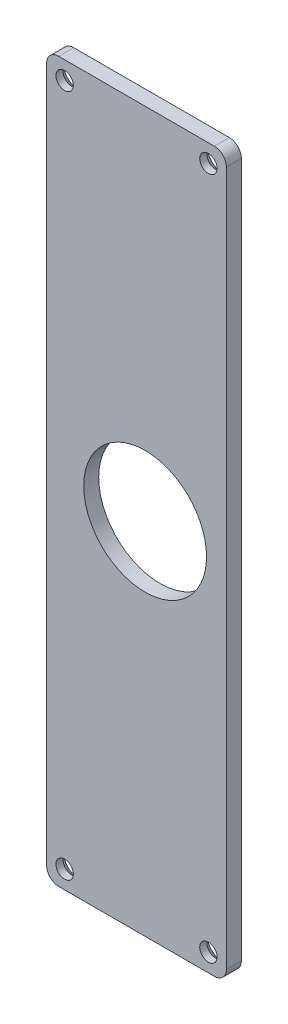
ISO-10303-21;
HEADER;
FILE_DESCRIPTION(('STEP AP214'),'2;1');
FILE_NAME('part.step','',(''),(''),'','','');
FILE_SCHEMA(('AUTOMOTIVE_DESIGN { 1 0 10303 214 1 1 1 1 }'));
ENDSEC;
DATA;
#1=APPLICATION_CONTEXT('core data for automotive mechanical design processes');
#2=APPLICATION_PROTOCOL_DEFINITION('international standard','automotive_design',2000,#1);
#3=PRODUCT_CONTEXT('',#1,'mechanical');
#4=PRODUCT('Part','Part','',(#3));
#5=PRODUCT_RELATED_PRODUCT_CATEGORY('part','',(#4));
#6=PRODUCT_DEFINITION_FORMATION('','',#4);
#7=PRODUCT_DEFINITION_CONTEXT('part definition',#1,'design');
#8=PRODUCT_DEFINITION('design','',#6,#7);
#9=PRODUCT_DEFINITION_SHAPE('','',#8);
#10=(LENGTH_UNIT() NAMED_UNIT(*) SI_UNIT(.MILLI.,.METRE.));
#11=(NAMED_UNIT(*) PLANE_ANGLE_UNIT() SI_UNIT($,.RADIAN.));
#12=(NAMED_UNIT(*) SI_UNIT($,.STERADIAN.) SOLID_ANGLE_UNIT());
#13=UNCERTAINTY_MEASURE_WITH_UNIT(LENGTH_MEASURE(1.E-05),#10,'distance_accuracy_value','');
#14=(GEOMETRIC_REPRESENTATION_CONTEXT(3) GLOBAL_UNCERTAINTY_ASSIGNED_CONTEXT((#13)) GLOBAL_UNIT_ASSIGNED_CONTEXT((#10,
#11,#12)) REPRESENTATION_CONTEXT('',''));
#15=CARTESIAN_POINT('',(0.,0.,0.));
#16=DIRECTION('',(0.,0.,1.));
#17=DIRECTION('',(1.,0.,0.));
#18=AXIS2_PLACEMENT_3D('',#15,#16,#17);
#19=CARTESIAN_POINT('',(-91.1225727439967,-25.5678939773836,2.5));
#20=DIRECTION('',(0.,0.,-1.));
#21=DIRECTION('',(-1.,0.,0.));
#22=AXIS2_PLACEMENT_3D('',#19,#20,#21);
#23=CYLINDRICAL_SURFACE('',#22,1.99999999999999);
#24=CARTESIAN_POINT('',(-91.1225727439967,-25.5678939773836,0.));
#25=DIRECTION('',(0.,0.,1.));
#26=DIRECTION('',(-1.,0.,0.));
#27=AXIS2_PLACEMENT_3D('',#24,#25,#26);
#28=CIRCLE('',#27,1.99999999999999);
#29=CARTESIAN_POINT('',(-93.1225727439967,-25.5678939773836,0.));
#30=VERTEX_POINT('',#29);
#31=CARTESIAN_POINT('',(-91.1225727439967,-27.5678939773836,0.));
#32=VERTEX_POINT('',#31);
#33=EDGE_CURVE('E135',#30,#32,#28,.T.);
#34=ORIENTED_EDGE('',*,*,#33,.T.);
#35=DIRECTION('',(0.,0.,-1.));
#36=VECTOR('',#35,1.);
#37=CARTESIAN_POINT('',(-91.1225727439967,-27.5678939773836,2.5));
#38=LINE('',#37,#36);
#39=CARTESIAN_POINT('',(-91.1225727439967,-27.5678939773836,2.5));
#40=VERTEX_POINT('',#39);
#41=EDGE_CURVE('E11',#40,#32,#38,.T.);
#42=ORIENTED_EDGE('',*,*,#41,.F.);
#43=CARTESIAN_POINT('',(-91.1225727439967,-25.5678939773836,2.5));
#44=DIRECTION('',(0.,0.,1.));
#45=DIRECTION('',(-1.,0.,0.));
#46=AXIS2_PLACEMENT_3D('',#43,#44,#45);
#47=CIRCLE('',#46,1.99999999999999);
#48=CARTESIAN_POINT('',(-93.1225727439967,-25.5678939773836,2.5));
#49=VERTEX_POINT('',#48);
#50=EDGE_CURVE('E150',#49,#40,#47,.T.);
#51=ORIENTED_EDGE('',*,*,#50,.F.);
#52=DIRECTION('',(0.,0.,-1.));
#53=VECTOR('',#52,1.);
#54=CARTESIAN_POINT('',(-93.1225727439967,-25.5678939773836,2.5));
#55=LINE('',#54,#53);
#56=EDGE_CURVE('E131',#49,#30,#55,.T.);
#57=ORIENTED_EDGE('',*,*,#56,.T.);
#58=EDGE_LOOP('',(#34,#42,#51,#57));
#59=FACE_BOUND('',#58,.T.);
#60=ADVANCED_FACE('F39',(#59),#23,.T.);
#61=CARTESIAN_POINT('',(-91.1225727439967,-27.5678939773836,2.5));
#62=DIRECTION('',(0.,1.,0.));
#63=DIRECTION('',(-1.,0.,0.));
#64=AXIS2_PLACEMENT_3D('',#61,#62,#63);
#65=PLANE('',#64);
#66=DIRECTION('',(1.,0.,0.));
#67=VECTOR('',#66,1.);
#68=CARTESIAN_POINT('',(-91.1225727439967,-27.5678939773836,0.));
#69=LINE('',#68,#67);
#70=CARTESIAN_POINT('',(-65.1225727439967,-27.5678939773836,0.));
#71=VERTEX_POINT('',#70);
#72=EDGE_CURVE('E138',#32,#71,#69,.T.);
#73=ORIENTED_EDGE('',*,*,#72,.T.);
#74=DIRECTION('',(0.,0.,-1.));
#75=VECTOR('',#74,1.);
#76=CARTESIAN_POINT('',(-65.1225727439967,-27.5678939773836,2.5));
#77=LINE('',#76,#75);
#78=CARTESIAN_POINT('',(-65.1225727439967,-27.5678939773836,2.5));
#79=VERTEX_POINT('',#78);
#80=EDGE_CURVE('E47',#79,#71,#77,.T.);
#81=ORIENTED_EDGE('',*,*,#80,.F.);
#82=DIRECTION('',(1.,0.,0.));
#83=VECTOR('',#82,1.);
#84=CARTESIAN_POINT('',(-91.1225727439967,-27.5678939773836,2.5));
#85=LINE('',#84,#83);
#86=EDGE_CURVE('E98',#40,#79,#85,.T.);
#87=ORIENTED_EDGE('',*,*,#86,.F.);
#88=ORIENTED_EDGE('',*,*,#41,.T.);
#89=EDGE_LOOP('',(#73,#81,#87,#88));
#90=FACE_BOUND('',#89,.T.);
#91=ADVANCED_FACE('F262',(#90),#65,.F.);
#92=CARTESIAN_POINT('',(-65.1225727439967,-25.5678939773836,2.5));
#93=DIRECTION('',(0.,0.,-1.));
#94=DIRECTION('',(-1.,0.,0.));
#95=AXIS2_PLACEMENT_3D('',#92,#93,#94);
#96=CYLINDRICAL_SURFACE('',#95,2.);
#97=CARTESIAN_POINT('',(-65.1225727439967,-25.5678939773836,0.));
#98=DIRECTION('',(0.,0.,1.));
#99=DIRECTION('',(1.,0.,0.));
#100=AXIS2_PLACEMENT_3D('',#97,#98,#99);
#101=CIRCLE('',#100,2.);
#102=CARTESIAN_POINT('',(-63.1225727439967,-25.5678939773836,0.));
#103=VERTEX_POINT('',#102);
#104=EDGE_CURVE('E141',#71,#103,#101,.T.);
#105=ORIENTED_EDGE('',*,*,#104,.T.);
#106=DIRECTION('',(0.,0.,-1.));
#107=VECTOR('',#106,1.);
#108=CARTESIAN_POINT('',(-63.1225727439967,-25.5678939773836,2.5));
#109=LINE('',#108,#107);
#110=CARTESIAN_POINT('',(-63.1225727439967,-25.5678939773836,2.5));
#111=VERTEX_POINT('',#110);
#112=EDGE_CURVE('E157',#111,#103,#109,.T.);
#113=ORIENTED_EDGE('',*,*,#112,.F.);
#114=CARTESIAN_POINT('',(-65.1225727439967,-25.5678939773836,2.5));
#115=DIRECTION('',(0.,0.,1.));
#116=DIRECTION('',(1.,0.,0.));
#117=AXIS2_PLACEMENT_3D('',#114,#115,#116);
#118=CIRCLE('',#117,2.);
#119=EDGE_CURVE('E165',#79,#111,#118,.T.);
#120=ORIENTED_EDGE('',*,*,#119,.F.);
#121=ORIENTED_EDGE('',*,*,#80,.T.);
#122=EDGE_LOOP('',(#105,#113,#120,#121));
#123=FACE_BOUND('',#122,.T.);
#124=ADVANCED_FACE('F163',(#123),#96,.T.);
#125=CARTESIAN_POINT('',(-63.1225727439967,90.4321060226164,2.5));
#126=DIRECTION('',(-1.,0.,0.));
#127=DIRECTION('',(0.,-1.,0.));
#128=AXIS2_PLACEMENT_3D('',#125,#126,#127);
#129=PLANE('',#128);
#130=DIRECTION('',(0.,1.,0.));
#131=VECTOR('',#130,1.);
#132=CARTESIAN_POINT('',(-63.1225727439967,90.4321060226164,0.));
#133=LINE('',#132,#131);
#134=CARTESIAN_POINT('',(-63.1225727439967,90.4321060226164,0.));
#135=VERTEX_POINT('',#134);
#136=EDGE_CURVE('E143',#103,#135,#133,.T.);
#137=ORIENTED_EDGE('',*,*,#136,.T.);
#138=DIRECTION('',(0.,0.,-1.));
#139=VECTOR('',#138,1.);
#140=CARTESIAN_POINT('',(-63.1225727439967,90.4321060226164,2.5));
#141=LINE('',#140,#139);
#142=CARTESIAN_POINT('',(-63.1225727439967,90.4321060226164,2.5));
#143=VERTEX_POINT('',#142);
#144=EDGE_CURVE('E154',#143,#135,#141,.T.);
#145=ORIENTED_EDGE('',*,*,#144,.F.);
#146=DIRECTION('',(0.,1.,0.));
#147=VECTOR('',#146,1.);
#148=CARTESIAN_POINT('',(-63.1225727439967,90.4321060226164,2.5));
#149=LINE('',#148,#147);
#150=EDGE_CURVE('E177',#111,#143,#149,.T.);
#151=ORIENTED_EDGE('',*,*,#150,.F.);
#152=ORIENTED_EDGE('',*,*,#112,.T.);
#153=EDGE_LOOP('',(#137,#145,#151,#152));
#154=FACE_BOUND('',#153,.T.);
#155=ADVANCED_FACE('F173',(#154),#129,.F.);
#156=CARTESIAN_POINT('',(-65.1225727439967,90.4321060226164,2.5));
#157=DIRECTION('',(0.,0.,-1.));
#158=DIRECTION('',(-1.,0.,0.));
#159=AXIS2_PLACEMENT_3D('',#156,#157,#158);
#160=CYLINDRICAL_SURFACE('',#159,2.);
#161=CARTESIAN_POINT('',(-65.1225727439967,90.4321060226164,0.));
#162=DIRECTION('',(0.,0.,1.));
#163=DIRECTION('',(-1.,0.,0.));
#164=AXIS2_PLACEMENT_3D('',#161,#162,#163);
#165=CIRCLE('',#164,2.);
#166=CARTESIAN_POINT('',(-65.1225727439967,92.4321060226164,0.));
#167=VERTEX_POINT('',#166);
#168=EDGE_CURVE('E145',#135,#167,#165,.T.);
#169=ORIENTED_EDGE('',*,*,#168,.T.);
#170=DIRECTION('',(0.,0.,-1.));
#171=VECTOR('',#170,1.);
#172=CARTESIAN_POINT('',(-65.1225727439967,92.4321060226164,2.5));
#173=LINE('',#172,#171);
#174=CARTESIAN_POINT('',(-65.1225727439967,92.4321060226164,2.5));
#175=VERTEX_POINT('',#174);
#176=EDGE_CURVE('E126',#175,#167,#173,.T.);
#177=ORIENTED_EDGE('',*,*,#176,.F.);
#178=CARTESIAN_POINT('',(-65.1225727439967,90.4321060226164,2.5));
#179=DIRECTION('',(0.,0.,1.));
#180=DIRECTION('',(-1.,0.,0.));
#181=AXIS2_PLACEMENT_3D('',#178,#179,#180);
#182=CIRCLE('',#181,2.);
#183=EDGE_CURVE('E117',#143,#175,#182,.T.);
#184=ORIENTED_EDGE('',*,*,#183,.F.);
#185=ORIENTED_EDGE('',*,*,#144,.T.);
#186=EDGE_LOOP('',(#169,#177,#184,#185));
#187=FACE_BOUND('',#186,.T.);
#188=ADVANCED_FACE('F176',(#187),#160,.T.);
#189=CARTESIAN_POINT('',(-91.1225727439967,92.4321060226164,2.5));
#190=DIRECTION('',(0.,-1.,0.));
#191=DIRECTION('',(0.,0.,-1.));
#192=AXIS2_PLACEMENT_3D('',#189,#190,#191);
#193=PLANE('',#192);
#194=DIRECTION('',(-1.,0.,0.));
#195=VECTOR('',#194,1.);
#196=CARTESIAN_POINT('',(-91.1225727439967,92.4321060226164,0.));
#197=LINE('',#196,#195);
#198=CARTESIAN_POINT('',(-91.1225727439967,92.4321060226164,0.));
#199=VERTEX_POINT('',#198);
#200=EDGE_CURVE('E125',#167,#199,#197,.T.);
#201=ORIENTED_EDGE('',*,*,#200,.T.);
#202=DIRECTION('',(0.,0.,-1.));
#203=VECTOR('',#202,1.);
#204=CARTESIAN_POINT('',(-91.1225727439967,92.4321060226164,2.5));
#205=LINE('',#204,#203);
#206=CARTESIAN_POINT('',(-91.1225727439967,92.4321060226164,2.5));
#207=VERTEX_POINT('',#206);
#208=EDGE_CURVE('E122',#207,#199,#205,.T.);
#209=ORIENTED_EDGE('',*,*,#208,.F.);
#210=DIRECTION('',(-1.,0.,0.));
#211=VECTOR('',#210,1.);
#212=CARTESIAN_POINT('',(-91.1225727439967,92.4321060226164,2.5));
#213=LINE('',#212,#211);
#214=EDGE_CURVE('E111',#175,#207,#213,.T.);
#215=ORIENTED_EDGE('',*,*,#214,.F.);
#216=ORIENTED_EDGE('',*,*,#176,.T.);
#217=EDGE_LOOP('',(#201,#209,#215,#216));
#218=FACE_BOUND('',#217,.T.);
#219=ADVANCED_FACE('F123',(#218),#193,.F.);
#220=CARTESIAN_POINT('',(-91.1225727439967,90.4321060226164,2.5));
#221=DIRECTION('',(0.,0.,-1.));
#222=DIRECTION('',(-1.,0.,0.));
#223=AXIS2_PLACEMENT_3D('',#220,#221,#222);
#224=CYLINDRICAL_SURFACE('',#223,1.99999999999999);
#225=CARTESIAN_POINT('',(-91.1225727439967,90.4321060226164,0.));
#226=DIRECTION('',(0.,0.,1.));
#227=DIRECTION('',(-1.,0.,0.));
#228=AXIS2_PLACEMENT_3D('',#225,#226,#227);
#229=CIRCLE('',#228,1.99999999999999);
#230=CARTESIAN_POINT('',(-93.1225727439967,90.4321060226164,0.));
#231=VERTEX_POINT('',#230);
#232=EDGE_CURVE('E84',#199,#231,#229,.T.);
#233=ORIENTED_EDGE('',*,*,#232,.T.);
#234=DIRECTION('',(0.,0.,-1.));
#235=VECTOR('',#234,1.);
#236=CARTESIAN_POINT('',(-93.1225727439967,90.4321060226164,2.5));
#237=LINE('',#236,#235);
#238=CARTESIAN_POINT('',(-93.1225727439967,90.4321060226164,2.5));
#239=VERTEX_POINT('',#238);
#240=EDGE_CURVE('E127',#239,#231,#237,.T.);
#241=ORIENTED_EDGE('',*,*,#240,.F.);
#242=CARTESIAN_POINT('',(-91.1225727439967,90.4321060226164,2.5));
#243=DIRECTION('',(0.,0.,1.));
#244=DIRECTION('',(-1.,0.,0.));
#245=AXIS2_PLACEMENT_3D('',#242,#243,#244);
#246=CIRCLE('',#245,1.99999999999999);
#247=EDGE_CURVE('E115',#207,#239,#246,.T.);
#248=ORIENTED_EDGE('',*,*,#247,.F.);
#249=ORIENTED_EDGE('',*,*,#208,.T.);
#250=EDGE_LOOP('',(#233,#241,#248,#249));
#251=FACE_BOUND('',#250,.T.);
#252=ADVANCED_FACE('F129',(#251),#224,.T.);
#253=CARTESIAN_POINT('',(-93.1225727439967,-25.5678939773836,2.5));
#254=DIRECTION('',(1.,0.,0.));
#255=DIRECTION('',(0.,0.,-1.));
#256=AXIS2_PLACEMENT_3D('',#253,#254,#255);
#257=PLANE('',#256);
#258=DIRECTION('',(0.,-1.,0.));
#259=VECTOR('',#258,1.);
#260=CARTESIAN_POINT('',(-93.1225727439967,-25.5678939773836,0.));
#261=LINE('',#260,#259);
#262=EDGE_CURVE('E90',#231,#30,#261,.T.);
#263=ORIENTED_EDGE('',*,*,#262,.T.);
#264=ORIENTED_EDGE('',*,*,#56,.F.);
#265=DIRECTION('',(0.,-1.,0.));
#266=VECTOR('',#265,1.);
#267=CARTESIAN_POINT('',(-93.1225727439967,-25.5678939773836,2.5));
#268=LINE('',#267,#266);
#269=EDGE_CURVE('E55',#239,#49,#268,.T.);
#270=ORIENTED_EDGE('',*,*,#269,.F.);
#271=ORIENTED_EDGE('',*,*,#240,.T.);
#272=EDGE_LOOP('',(#263,#264,#270,#271));
#273=FACE_BOUND('',#272,.T.);
#274=ADVANCED_FACE('F269',(#273),#257,.F.);
#275=CARTESIAN_POINT('',(-91.1225727439967,-25.5678939773836,2.5));
#276=DIRECTION('',(0.,0.,-1.));
#277=DIRECTION('',(-1.,0.,0.));
#278=AXIS2_PLACEMENT_3D('',#275,#276,#277);
#279=PLANE('',#278);
#280=CARTESIAN_POINT('',(-76.6825727439967,32.4321060226164,2.5));
#281=DIRECTION('',(0.,0.,-1.));
#282=DIRECTION('',(-1.,0.,0.));
#283=AXIS2_PLACEMENT_3D('',#280,#281,#282);
#284=CIRCLE('',#283,10.25);
#285=CARTESIAN_POINT('',(-86.9325727439967,32.4321060226164,2.5));
#286=VERTEX_POINT('',#285);
#287=EDGE_CURVE('E218',#286,#286,#284,.T.);
#288=ORIENTED_EDGE('',*,*,#287,.T.);
#289=EDGE_LOOP('',(#288));
#290=FACE_BOUND('',#289,.T.);
#291=CARTESIAN_POINT('',(-66.1225727439967,89.4321060226164,2.5));
#292=DIRECTION('',(0.,0.,-1.));
#293=DIRECTION('',(-1.,0.,0.));
#294=AXIS2_PLACEMENT_3D('',#291,#292,#293);
#295=CIRCLE('',#294,1.44999999999999);
#296=CARTESIAN_POINT('',(-67.5725727439967,89.4321060226164,2.5));
#297=VERTEX_POINT('',#296);
#298=EDGE_CURVE('E209',#297,#297,#295,.T.);
#299=ORIENTED_EDGE('',*,*,#298,.T.);
#300=EDGE_LOOP('',(#299));
#301=FACE_BOUND('',#300,.T.);
#302=CARTESIAN_POINT('',(-90.1225727439967,89.4321060226164,2.5));
#303=DIRECTION('',(0.,0.,-1.));
#304=DIRECTION('',(-1.,0.,0.));
#305=AXIS2_PLACEMENT_3D('',#302,#303,#304);
#306=CIRCLE('',#305,1.44999999999999);
#307=CARTESIAN_POINT('',(-91.5725727439967,89.4321060226164,2.5));
#308=VERTEX_POINT('',#307);
#309=EDGE_CURVE('E200',#308,#308,#306,.T.);
#310=ORIENTED_EDGE('',*,*,#309,.T.);
#311=EDGE_LOOP('',(#310));
#312=FACE_BOUND('',#311,.T.);
#313=CARTESIAN_POINT('',(-66.1225727439967,-24.5678939773836,2.5));
#314=DIRECTION('',(0.,0.,-1.));
#315=DIRECTION('',(-1.,0.,0.));
#316=AXIS2_PLACEMENT_3D('',#313,#314,#315);
#317=CIRCLE('',#316,1.44999999999999);
#318=CARTESIAN_POINT('',(-67.5725727439967,-24.5678939773836,2.5));
#319=VERTEX_POINT('',#318);
#320=EDGE_CURVE('E191',#319,#319,#317,.T.);
#321=ORIENTED_EDGE('',*,*,#320,.T.);
#322=EDGE_LOOP('',(#321));
#323=FACE_BOUND('',#322,.T.);
#324=CARTESIAN_POINT('',(-90.1225727439967,-24.5678939773836,2.5));
#325=DIRECTION('',(0.,0.,-1.));
#326=DIRECTION('',(-1.,0.,0.));
#327=AXIS2_PLACEMENT_3D('',#324,#325,#326);
#328=CIRCLE('',#327,1.44999999999999);
#329=CARTESIAN_POINT('',(-91.5725727439967,-24.5678939773836,2.5));
#330=VERTEX_POINT('',#329);
#331=EDGE_CURVE('E139',#330,#330,#328,.T.);
#332=ORIENTED_EDGE('',*,*,#331,.T.);
#333=EDGE_LOOP('',(#332));
#334=FACE_BOUND('',#333,.T.);
#335=ORIENTED_EDGE('',*,*,#50,.T.);
#336=ORIENTED_EDGE('',*,*,#86,.T.);
#337=ORIENTED_EDGE('',*,*,#119,.T.);
#338=ORIENTED_EDGE('',*,*,#150,.T.);
#339=ORIENTED_EDGE('',*,*,#183,.T.);
#340=ORIENTED_EDGE('',*,*,#214,.T.);
#341=ORIENTED_EDGE('',*,*,#247,.T.);
#342=ORIENTED_EDGE('',*,*,#269,.T.);
#343=EDGE_LOOP('',(#335,#336,#337,#338,#339,#340,#341,#342));
#344=FACE_BOUND('',#343,.T.);
#345=ADVANCED_FACE('F113',(#290,#301,#312,#323,#334,#344),#279,.F.);
#346=CARTESIAN_POINT('',(-91.1225727439967,-25.5678939773836,0.));
#347=DIRECTION('',(0.,0.,-1.));
#348=DIRECTION('',(-1.,0.,0.));
#349=AXIS2_PLACEMENT_3D('',#346,#347,#348);
#350=PLANE('',#349);
#351=CARTESIAN_POINT('',(-76.6825727439967,32.4321060226164,0.));
#352=DIRECTION('',(0.,0.,-1.));
#353=DIRECTION('',(-1.,0.,0.));
#354=AXIS2_PLACEMENT_3D('',#351,#352,#353);
#355=CIRCLE('',#354,10.25);
#356=CARTESIAN_POINT('',(-86.9325727439967,32.4321060226164,0.));
#357=VERTEX_POINT('',#356);
#358=EDGE_CURVE('E219',#357,#357,#355,.T.);
#359=ORIENTED_EDGE('',*,*,#358,.F.);
#360=EDGE_LOOP('',(#359));
#361=FACE_BOUND('',#360,.T.);
#362=CARTESIAN_POINT('',(-66.1225727439967,89.4321060226164,0.));
#363=DIRECTION('',(0.,0.,-1.));
#364=DIRECTION('',(-1.,0.,0.));
#365=AXIS2_PLACEMENT_3D('',#362,#363,#364);
#366=CIRCLE('',#365,2.75);
#367=CARTESIAN_POINT('',(-68.8725727439967,89.4321060226164,0.));
#368=VERTEX_POINT('',#367);
#369=EDGE_CURVE('E215',#368,#368,#366,.T.);
#370=ORIENTED_EDGE('',*,*,#369,.F.);
#371=EDGE_LOOP('',(#370));
#372=FACE_BOUND('',#371,.T.);
#373=CARTESIAN_POINT('',(-90.1225727439967,89.4321060226164,0.));
#374=DIRECTION('',(0.,0.,-1.));
#375=DIRECTION('',(-1.,0.,0.));
#376=AXIS2_PLACEMENT_3D('',#373,#374,#375);
#377=CIRCLE('',#376,2.75);
#378=CARTESIAN_POINT('',(-92.8725727439967,89.4321060226164,0.));
#379=VERTEX_POINT('',#378);
#380=EDGE_CURVE('E206',#379,#379,#377,.T.);
#381=ORIENTED_EDGE('',*,*,#380,.F.);
#382=EDGE_LOOP('',(#381));
#383=FACE_BOUND('',#382,.T.);
#384=CARTESIAN_POINT('',(-66.1225727439967,-24.5678939773836,0.));
#385=DIRECTION('',(0.,0.,-1.));
#386=DIRECTION('',(-1.,0.,0.));
#387=AXIS2_PLACEMENT_3D('',#384,#385,#386);
#388=CIRCLE('',#387,2.75);
#389=CARTESIAN_POINT('',(-68.8725727439967,-24.5678939773836,0.));
#390=VERTEX_POINT('',#389);
#391=EDGE_CURVE('E197',#390,#390,#388,.T.);
#392=ORIENTED_EDGE('',*,*,#391,.F.);
#393=EDGE_LOOP('',(#392));
#394=FACE_BOUND('',#393,.T.);
#395=CARTESIAN_POINT('',(-90.1225727439967,-24.5678939773836,0.));
#396=DIRECTION('',(0.,0.,-1.));
#397=DIRECTION('',(-1.,0.,0.));
#398=AXIS2_PLACEMENT_3D('',#395,#396,#397);
#399=CIRCLE('',#398,2.75);
#400=CARTESIAN_POINT('',(-92.8725727439967,-24.5678939773836,0.));
#401=VERTEX_POINT('',#400);
#402=EDGE_CURVE('E188',#401,#401,#399,.T.);
#403=ORIENTED_EDGE('',*,*,#402,.F.);
#404=EDGE_LOOP('',(#403));
#405=FACE_BOUND('',#404,.T.);
#406=ORIENTED_EDGE('',*,*,#33,.F.);
#407=ORIENTED_EDGE('',*,*,#262,.F.);
#408=ORIENTED_EDGE('',*,*,#232,.F.);
#409=ORIENTED_EDGE('',*,*,#200,.F.);
#410=ORIENTED_EDGE('',*,*,#168,.F.);
#411=ORIENTED_EDGE('',*,*,#136,.F.);
#412=ORIENTED_EDGE('',*,*,#104,.F.);
#413=ORIENTED_EDGE('',*,*,#72,.F.);
#414=EDGE_LOOP('',(#406,#407,#408,#409,#410,#411,#412,#413));
#415=FACE_BOUND('',#414,.T.);
#416=ADVANCED_FACE('F169',(#361,#372,#383,#394,#405,#415),#350,.T.);
#417=CARTESIAN_POINT('',(-90.1225727439967,-24.5678939773836,0.));
#418=DIRECTION('',(0.,0.,-1.));
#419=DIRECTION('',(-1.,0.,0.));
#420=AXIS2_PLACEMENT_3D('',#417,#418,#419);
#421=CYLINDRICAL_SURFACE('',#420,1.44999999999999);
#422=ORIENTED_EDGE('',*,*,#331,.F.);
#423=EDGE_LOOP('',(#422));
#424=FACE_BOUND('',#423,.T.);
#425=CARTESIAN_POINT('',(-90.1225727439967,-24.5678939773836,1.30000000000001));
#426=DIRECTION('',(0.,0.,-1.));
#427=DIRECTION('',(-1.,0.,0.));
#428=AXIS2_PLACEMENT_3D('',#425,#426,#427);
#429=CIRCLE('',#428,1.44999999999999);
#430=CARTESIAN_POINT('',(-91.5725727439967,-24.5678939773836,1.30000000000001));
#431=VERTEX_POINT('',#430);
#432=EDGE_CURVE('E185',#431,#431,#429,.T.);
#433=ORIENTED_EDGE('',*,*,#432,.T.);
#434=EDGE_LOOP('',(#433));
#435=FACE_BOUND('',#434,.T.);
#436=ADVANCED_FACE('F236',(#424,#435),#421,.F.);
#437=CARTESIAN_POINT('',(-90.1225727439967,-24.5678939773836,0.));
#438=DIRECTION('',(0.,0.,-1.));
#439=DIRECTION('',(-1.,0.,0.));
#440=AXIS2_PLACEMENT_3D('',#437,#438,#439);
#441=CONICAL_SURFACE('',#440,2.75,0.785398163397448);
#442=ORIENTED_EDGE('',*,*,#432,.F.);
#443=EDGE_LOOP('',(#442));
#444=FACE_BOUND('',#443,.T.);
#445=ORIENTED_EDGE('',*,*,#402,.T.);
#446=EDGE_LOOP('',(#445));
#447=FACE_BOUND('',#446,.T.);
#448=ADVANCED_FACE('F246',(#444,#447),#441,.F.);
#449=CARTESIAN_POINT('',(-66.1225727439967,-24.5678939773836,0.));
#450=DIRECTION('',(0.,0.,-1.));
#451=DIRECTION('',(-1.,0.,0.));
#452=AXIS2_PLACEMENT_3D('',#449,#450,#451);
#453=CYLINDRICAL_SURFACE('',#452,1.44999999999999);
#454=ORIENTED_EDGE('',*,*,#320,.F.);
#455=EDGE_LOOP('',(#454));
#456=FACE_BOUND('',#455,.T.);
#457=CARTESIAN_POINT('',(-66.1225727439967,-24.5678939773836,1.30000000000001));
#458=DIRECTION('',(0.,0.,-1.));
#459=DIRECTION('',(-1.,0.,0.));
#460=AXIS2_PLACEMENT_3D('',#457,#458,#459);
#461=CIRCLE('',#460,1.44999999999999);
#462=CARTESIAN_POINT('',(-67.5725727439967,-24.5678939773836,1.30000000000001));
#463=VERTEX_POINT('',#462);
#464=EDGE_CURVE('E194',#463,#463,#461,.T.);
#465=ORIENTED_EDGE('',*,*,#464,.T.);
#466=EDGE_LOOP('',(#465));
#467=FACE_BOUND('',#466,.T.);
#468=ADVANCED_FACE('F248',(#456,#467),#453,.F.);
#469=CARTESIAN_POINT('',(-66.1225727439967,-24.5678939773836,0.));
#470=DIRECTION('',(0.,0.,-1.));
#471=DIRECTION('',(-1.,0.,0.));
#472=AXIS2_PLACEMENT_3D('',#469,#470,#471);
#473=CONICAL_SURFACE('',#472,2.75,0.785398163397448);
#474=ORIENTED_EDGE('',*,*,#464,.F.);
#475=EDGE_LOOP('',(#474));
#476=FACE_BOUND('',#475,.T.);
#477=ORIENTED_EDGE('',*,*,#391,.T.);
#478=EDGE_LOOP('',(#477));
#479=FACE_BOUND('',#478,.T.);
#480=ADVANCED_FACE('F255',(#476,#479),#473,.F.);
#481=CARTESIAN_POINT('',(-90.1225727439967,89.4321060226164,0.));
#482=DIRECTION('',(0.,0.,-1.));
#483=DIRECTION('',(-1.,0.,0.));
#484=AXIS2_PLACEMENT_3D('',#481,#482,#483);
#485=CYLINDRICAL_SURFACE('',#484,1.44999999999999);
#486=ORIENTED_EDGE('',*,*,#309,.F.);
#487=EDGE_LOOP('',(#486));
#488=FACE_BOUND('',#487,.T.);
#489=CARTESIAN_POINT('',(-90.1225727439967,89.4321060226164,1.30000000000001));
#490=DIRECTION('',(0.,0.,-1.));
#491=DIRECTION('',(-1.,0.,0.));
#492=AXIS2_PLACEMENT_3D('',#489,#490,#491);
#493=CIRCLE('',#492,1.44999999999999);
#494=CARTESIAN_POINT('',(-91.5725727439967,89.4321060226164,1.30000000000001));
#495=VERTEX_POINT('',#494);
#496=EDGE_CURVE('E203',#495,#495,#493,.T.);
#497=ORIENTED_EDGE('',*,*,#496,.T.);
#498=EDGE_LOOP('',(#497));
#499=FACE_BOUND('',#498,.T.);
#500=ADVANCED_FACE('F353',(#488,#499),#485,.F.);
#501=CARTESIAN_POINT('',(-90.1225727439967,89.4321060226164,0.));
#502=DIRECTION('',(0.,0.,-1.));
#503=DIRECTION('',(-1.,0.,0.));
#504=AXIS2_PLACEMENT_3D('',#501,#502,#503);
#505=CONICAL_SURFACE('',#504,2.75,0.785398163397448);
#506=ORIENTED_EDGE('',*,*,#496,.F.);
#507=EDGE_LOOP('',(#506));
#508=FACE_BOUND('',#507,.T.);
#509=ORIENTED_EDGE('',*,*,#380,.T.);
#510=EDGE_LOOP('',(#509));
#511=FACE_BOUND('',#510,.T.);
#512=ADVANCED_FACE('F363',(#508,#511),#505,.F.);
#513=CARTESIAN_POINT('',(-66.1225727439967,89.4321060226164,0.));
#514=DIRECTION('',(0.,0.,-1.));
#515=DIRECTION('',(-1.,0.,0.));
#516=AXIS2_PLACEMENT_3D('',#513,#514,#515);
#517=CYLINDRICAL_SURFACE('',#516,1.44999999999999);
#518=ORIENTED_EDGE('',*,*,#298,.F.);
#519=EDGE_LOOP('',(#518));
#520=FACE_BOUND('',#519,.T.);
#521=CARTESIAN_POINT('',(-66.1225727439967,89.4321060226164,1.30000000000001));
#522=DIRECTION('',(0.,0.,-1.));
#523=DIRECTION('',(-1.,0.,0.));
#524=AXIS2_PLACEMENT_3D('',#521,#522,#523);
#525=CIRCLE('',#524,1.44999999999999);
#526=CARTESIAN_POINT('',(-67.5725727439967,89.4321060226164,1.30000000000001));
#527=VERTEX_POINT('',#526);
#528=EDGE_CURVE('E212',#527,#527,#525,.T.);
#529=ORIENTED_EDGE('',*,*,#528,.T.);
#530=EDGE_LOOP('',(#529));
#531=FACE_BOUND('',#530,.T.);
#532=ADVANCED_FACE('F373',(#520,#531),#517,.F.);
#533=CARTESIAN_POINT('',(-66.1225727439967,89.4321060226164,0.));
#534=DIRECTION('',(0.,0.,-1.));
#535=DIRECTION('',(-1.,0.,0.));
#536=AXIS2_PLACEMENT_3D('',#533,#534,#535);
#537=CONICAL_SURFACE('',#536,2.75,0.785398163397448);
#538=ORIENTED_EDGE('',*,*,#528,.F.);
#539=EDGE_LOOP('',(#538));
#540=FACE_BOUND('',#539,.T.);
#541=ORIENTED_EDGE('',*,*,#369,.T.);
#542=EDGE_LOOP('',(#541));
#543=FACE_BOUND('',#542,.T.);
#544=ADVANCED_FACE('F230',(#540,#543),#537,.F.);
#545=CARTESIAN_POINT('',(-76.6825727439967,32.4321060226164,2.5));
#546=DIRECTION('',(0.,0.,-1.));
#547=DIRECTION('',(-1.,0.,0.));
#548=AXIS2_PLACEMENT_3D('',#545,#546,#547);
#549=CYLINDRICAL_SURFACE('',#548,10.25);
#550=ORIENTED_EDGE('',*,*,#287,.F.);
#551=EDGE_LOOP('',(#550));
#552=FACE_BOUND('',#551,.T.);
#553=ORIENTED_EDGE('',*,*,#358,.T.);
#554=EDGE_LOOP('',(#553));
#555=FACE_BOUND('',#554,.T.);
#556=ADVANCED_FACE('F227',(#552,#555),#549,.F.);
#557=CLOSED_SHELL('',(#60,#91,#124,#155,#188,#219,#252,#274,#345,#416,#436,#448,#468,#480,#500,
#512,#532,#544,#556));
#558=MANIFOLD_SOLID_BREP('B2',#557);
#559=ADVANCED_BREP_SHAPE_REPRESENTATION('',(#18,#558),#14);
#560=SHAPE_DEFINITION_REPRESENTATION(#9,#559);
ENDSEC;
END-ISO-10303-21;
